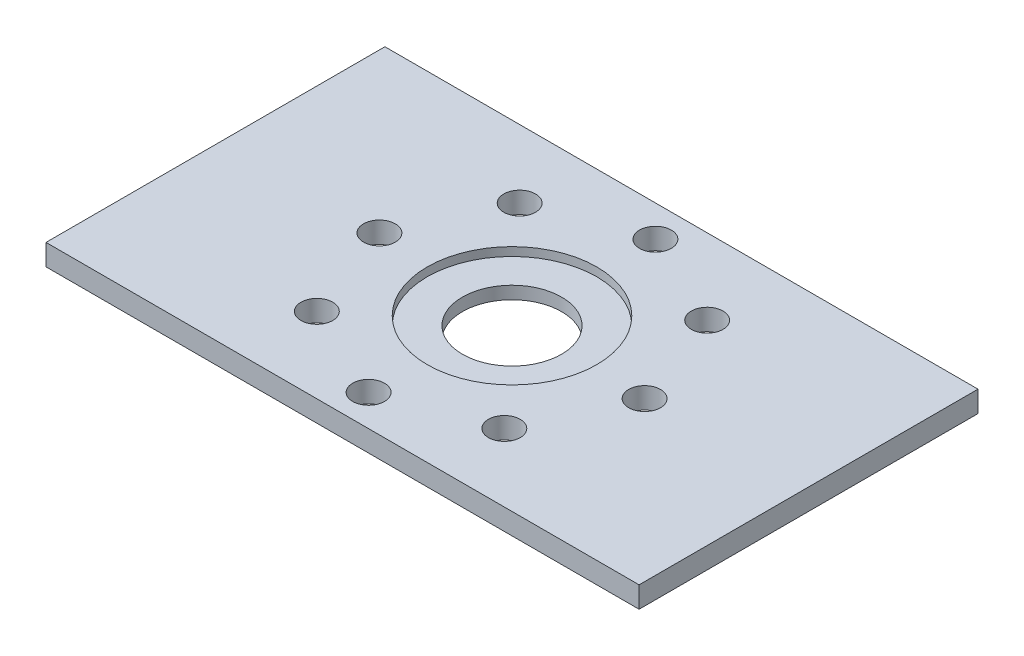
ISO-10303-21;
HEADER;
FILE_DESCRIPTION(('STEP AP214'),'2;1');
FILE_NAME('part.step','',(''),(''),'','','');
FILE_SCHEMA(('AUTOMOTIVE_DESIGN { 1 0 10303 214 1 1 1 1 }'));
ENDSEC;
DATA;
#1=APPLICATION_CONTEXT('core data for automotive mechanical design processes');
#2=APPLICATION_PROTOCOL_DEFINITION('international standard','automotive_design',2000,#1);
#3=PRODUCT_CONTEXT('',#1,'mechanical');
#4=PRODUCT('Part','Part','',(#3));
#5=PRODUCT_RELATED_PRODUCT_CATEGORY('part','',(#4));
#6=PRODUCT_DEFINITION_FORMATION('','',#4);
#7=PRODUCT_DEFINITION_CONTEXT('part definition',#1,'design');
#8=PRODUCT_DEFINITION('design','',#6,#7);
#9=PRODUCT_DEFINITION_SHAPE('','',#8);
#10=(LENGTH_UNIT() NAMED_UNIT(*) SI_UNIT(.MILLI.,.METRE.));
#11=(NAMED_UNIT(*) PLANE_ANGLE_UNIT() SI_UNIT($,.RADIAN.));
#12=(NAMED_UNIT(*) SI_UNIT($,.STERADIAN.) SOLID_ANGLE_UNIT());
#13=UNCERTAINTY_MEASURE_WITH_UNIT(LENGTH_MEASURE(1.E-05),#10,'distance_accuracy_value','');
#14=(GEOMETRIC_REPRESENTATION_CONTEXT(3) GLOBAL_UNCERTAINTY_ASSIGNED_CONTEXT((#13)) GLOBAL_UNIT_ASSIGNED_CONTEXT((#10,
#11,#12)) REPRESENTATION_CONTEXT('',''));
#15=CARTESIAN_POINT('',(0.,0.,0.));
#16=DIRECTION('',(0.,0.,1.));
#17=DIRECTION('',(1.,0.,0.));
#18=AXIS2_PLACEMENT_3D('',#15,#16,#17);
#19=CARTESIAN_POINT('',(0.,0.,0.));
#20=DIRECTION('',(0.,1.,0.));
#21=DIRECTION('',(0.,0.,1.));
#22=AXIS2_PLACEMENT_3D('',#19,#20,#21);
#23=CYLINDRICAL_SURFACE('',#22,14.859);
#24=CARTESIAN_POINT('',(0.,0.,0.));
#25=DIRECTION('',(0.,1.,0.));
#26=DIRECTION('',(0.,0.,1.));
#27=AXIS2_PLACEMENT_3D('',#24,#25,#26);
#28=CIRCLE('',#27,14.859);
#29=CARTESIAN_POINT('',(0.,0.,14.859));
#30=VERTEX_POINT('',#29);
#31=EDGE_CURVE('E105',#30,#30,#28,.T.);
#32=ORIENTED_EDGE('',*,*,#31,.F.);
#33=EDGE_LOOP('',(#32));
#34=FACE_BOUND('',#33,.T.);
#35=CARTESIAN_POINT('',(0.,3.7846,0.));
#36=DIRECTION('',(0.,1.,0.));
#37=DIRECTION('',(0.,0.,1.));
#38=AXIS2_PLACEMENT_3D('',#35,#36,#37);
#39=CIRCLE('',#38,14.859);
#40=CARTESIAN_POINT('',(0.,3.7846,14.859));
#41=VERTEX_POINT('',#40);
#42=EDGE_CURVE('E111',#41,#41,#39,.F.);
#43=ORIENTED_EDGE('',*,*,#42,.F.);
#44=EDGE_LOOP('',(#43));
#45=FACE_BOUND('',#44,.T.);
#46=ADVANCED_FACE('F35',(#34,#45),#23,.F.);
#47=CARTESIAN_POINT('',(88.9,6.35,50.8));
#48=DIRECTION('',(0.,0.,-1.));
#49=DIRECTION('',(-1.,0.,0.));
#50=AXIS2_PLACEMENT_3D('',#47,#48,#49);
#51=PLANE('',#50);
#52=DIRECTION('',(1.,0.,0.));
#53=VECTOR('',#52,1.);
#54=CARTESIAN_POINT('',(88.9,0.,50.8));
#55=LINE('',#54,#53);
#56=CARTESIAN_POINT('',(-88.9,0.,50.8));
#57=VERTEX_POINT('',#56);
#58=CARTESIAN_POINT('',(88.9,0.,50.8));
#59=VERTEX_POINT('',#58);
#60=EDGE_CURVE('E102',#57,#59,#55,.T.);
#61=ORIENTED_EDGE('',*,*,#60,.T.);
#62=DIRECTION('',(0.,-1.,0.));
#63=VECTOR('',#62,1.);
#64=CARTESIAN_POINT('',(88.9,6.35,50.8));
#65=LINE('',#64,#63);
#66=CARTESIAN_POINT('',(88.9,6.35,50.8));
#67=VERTEX_POINT('',#66);
#68=EDGE_CURVE('E11',#67,#59,#65,.T.);
#69=ORIENTED_EDGE('',*,*,#68,.F.);
#70=DIRECTION('',(1.,0.,0.));
#71=VECTOR('',#70,1.);
#72=CARTESIAN_POINT('',(88.9,6.35,50.8));
#73=LINE('',#72,#71);
#74=CARTESIAN_POINT('',(-88.9,6.35,50.8));
#75=VERTEX_POINT('',#74);
#76=EDGE_CURVE('E89',#75,#67,#73,.T.);
#77=ORIENTED_EDGE('',*,*,#76,.F.);
#78=DIRECTION('',(0.,-1.,0.));
#79=VECTOR('',#78,1.);
#80=CARTESIAN_POINT('',(-88.9,6.35,50.8));
#81=LINE('',#80,#79);
#82=EDGE_CURVE('E98',#75,#57,#81,.T.);
#83=ORIENTED_EDGE('',*,*,#82,.T.);
#84=EDGE_LOOP('',(#61,#69,#77,#83));
#85=FACE_BOUND('',#84,.T.);
#86=ADVANCED_FACE('F37',(#85),#51,.F.);
#87=CARTESIAN_POINT('',(88.9,6.35,50.8));
#88=DIRECTION('',(-1.,0.,0.));
#89=DIRECTION('',(0.,0.,1.));
#90=AXIS2_PLACEMENT_3D('',#87,#88,#89);
#91=PLANE('',#90);
#92=DIRECTION('',(0.,0.,-1.));
#93=VECTOR('',#92,1.);
#94=CARTESIAN_POINT('',(88.9,0.,50.8));
#95=LINE('',#94,#93);
#96=CARTESIAN_POINT('',(88.9,0.,-50.8));
#97=VERTEX_POINT('',#96);
#98=EDGE_CURVE('E93',#59,#97,#95,.T.);
#99=ORIENTED_EDGE('',*,*,#98,.T.);
#100=DIRECTION('',(0.,-1.,0.));
#101=VECTOR('',#100,1.);
#102=CARTESIAN_POINT('',(88.9,6.35,-50.8));
#103=LINE('',#102,#101);
#104=CARTESIAN_POINT('',(88.9,6.35,-50.8));
#105=VERTEX_POINT('',#104);
#106=EDGE_CURVE('E45',#105,#97,#103,.T.);
#107=ORIENTED_EDGE('',*,*,#106,.F.);
#108=DIRECTION('',(0.,0.,-1.));
#109=VECTOR('',#108,1.);
#110=CARTESIAN_POINT('',(88.9,6.35,50.8));
#111=LINE('',#110,#109);
#112=EDGE_CURVE('E84',#67,#105,#111,.T.);
#113=ORIENTED_EDGE('',*,*,#112,.F.);
#114=ORIENTED_EDGE('',*,*,#68,.T.);
#115=EDGE_LOOP('',(#99,#107,#113,#114));
#116=FACE_BOUND('',#115,.T.);
#117=ADVANCED_FACE('F92',(#116),#91,.F.);
#118=CARTESIAN_POINT('',(88.9,6.35,-50.8));
#119=DIRECTION('',(0.,0.,1.));
#120=DIRECTION('',(1.,0.,0.));
#121=AXIS2_PLACEMENT_3D('',#118,#119,#120);
#122=PLANE('',#121);
#123=DIRECTION('',(-1.,0.,0.));
#124=VECTOR('',#123,1.);
#125=CARTESIAN_POINT('',(88.9,0.,-50.8));
#126=LINE('',#125,#124);
#127=CARTESIAN_POINT('',(-88.9,0.,-50.8));
#128=VERTEX_POINT('',#127);
#129=EDGE_CURVE('E71',#97,#128,#126,.T.);
#130=ORIENTED_EDGE('',*,*,#129,.T.);
#131=DIRECTION('',(0.,-1.,0.));
#132=VECTOR('',#131,1.);
#133=CARTESIAN_POINT('',(-88.9,6.35,-50.8));
#134=LINE('',#133,#132);
#135=CARTESIAN_POINT('',(-88.9,6.35,-50.8));
#136=VERTEX_POINT('',#135);
#137=EDGE_CURVE('E94',#136,#128,#134,.T.);
#138=ORIENTED_EDGE('',*,*,#137,.F.);
#139=DIRECTION('',(-1.,0.,0.));
#140=VECTOR('',#139,1.);
#141=CARTESIAN_POINT('',(88.9,6.35,-50.8));
#142=LINE('',#141,#140);
#143=EDGE_CURVE('E87',#105,#136,#142,.T.);
#144=ORIENTED_EDGE('',*,*,#143,.F.);
#145=ORIENTED_EDGE('',*,*,#106,.T.);
#146=EDGE_LOOP('',(#130,#138,#144,#145));
#147=FACE_BOUND('',#146,.T.);
#148=ADVANCED_FACE('F96',(#147),#122,.F.);
#149=CARTESIAN_POINT('',(-88.9,6.35,50.8));
#150=DIRECTION('',(1.,0.,0.));
#151=DIRECTION('',(0.,0.,-1.));
#152=AXIS2_PLACEMENT_3D('',#149,#150,#151);
#153=PLANE('',#152);
#154=DIRECTION('',(0.,0.,1.));
#155=VECTOR('',#154,1.);
#156=CARTESIAN_POINT('',(-88.9,0.,50.8));
#157=LINE('',#156,#155);
#158=EDGE_CURVE('E77',#128,#57,#157,.T.);
#159=ORIENTED_EDGE('',*,*,#158,.T.);
#160=ORIENTED_EDGE('',*,*,#82,.F.);
#161=DIRECTION('',(0.,0.,1.));
#162=VECTOR('',#161,1.);
#163=CARTESIAN_POINT('',(-88.9,6.35,50.8));
#164=LINE('',#163,#162);
#165=EDGE_CURVE('E54',#136,#75,#164,.T.);
#166=ORIENTED_EDGE('',*,*,#165,.F.);
#167=ORIENTED_EDGE('',*,*,#137,.T.);
#168=EDGE_LOOP('',(#159,#160,#166,#167));
#169=FACE_BOUND('',#168,.T.);
#170=ADVANCED_FACE('F182',(#169),#153,.F.);
#171=CARTESIAN_POINT('',(0.,6.35,0.));
#172=DIRECTION('',(0.,-1.,0.));
#173=DIRECTION('',(0.,0.,-1.));
#174=AXIS2_PLACEMENT_3D('',#171,#172,#173);
#175=PLANE('',#174);
#176=CARTESIAN_POINT('',(-41.3701595695863,6.35,-1.62342267662033));
#177=DIRECTION('',(0.,1.,0.));
#178=DIRECTION('',(1.,0.,0.));
#179=AXIS2_PLACEMENT_3D('',#176,#177,#178);
#180=CIRCLE('',#179,4.7625);
#181=CARTESIAN_POINT('',(-36.6076595695863,6.35,-1.62342267662034));
#182=VERTEX_POINT('',#181);
#183=EDGE_CURVE('E308',#182,#182,#180,.T.);
#184=ORIENTED_EDGE('',*,*,#183,.F.);
#185=EDGE_LOOP('',(#184));
#186=FACE_BOUND('',#185,.T.);
#187=CARTESIAN_POINT('',(-30.4010535537942,6.35,28.1051871870538));
#188=DIRECTION('',(0.,1.,0.));
#189=DIRECTION('',(0.707106781186544,0.,-0.707106781186551));
#190=AXIS2_PLACEMENT_3D('',#187,#188,#189);
#191=CIRCLE('',#190,4.7625);
#192=CARTESIAN_POINT('',(-27.0334575083933,6.35,24.7375911416529));
#193=VERTEX_POINT('',#192);
#194=EDGE_CURVE('E309',#193,#193,#191,.T.);
#195=ORIENTED_EDGE('',*,*,#194,.F.);
#196=EDGE_LOOP('',(#195));
#197=FACE_BOUND('',#196,.T.);
#198=CARTESIAN_POINT('',(-1.62342267662047,6.35,41.3701595695863));
#199=DIRECTION('',(0.,1.,0.));
#200=DIRECTION('',(0.,0.,-1.));
#201=AXIS2_PLACEMENT_3D('',#198,#199,#200);
#202=CIRCLE('',#201,4.7625);
#203=CARTESIAN_POINT('',(-1.62342267662047,6.35,36.6076595695863));
#204=VERTEX_POINT('',#203);
#205=EDGE_CURVE('E313',#204,#204,#202,.T.);
#206=ORIENTED_EDGE('',*,*,#205,.F.);
#207=EDGE_LOOP('',(#206));
#208=FACE_BOUND('',#207,.T.);
#209=CARTESIAN_POINT('',(28.1051871870539,6.35,30.4010535537941));
#210=DIRECTION('',(0.,1.,0.));
#211=DIRECTION('',(-0.707106781186554,0.,-0.707106781186541));
#212=AXIS2_PLACEMENT_3D('',#209,#210,#211);
#213=CIRCLE('',#212,4.7625);
#214=CARTESIAN_POINT('',(24.737591141653,6.35,27.0334575083932));
#215=VERTEX_POINT('',#214);
#216=EDGE_CURVE('E320',#215,#215,#213,.T.);
#217=ORIENTED_EDGE('',*,*,#216,.F.);
#218=EDGE_LOOP('',(#217));
#219=FACE_BOUND('',#218,.T.);
#220=CARTESIAN_POINT('',(41.3701595695863,6.35,1.62342267662004));
#221=DIRECTION('',(0.,1.,0.));
#222=DIRECTION('',(-1.,0.,0.));
#223=AXIS2_PLACEMENT_3D('',#220,#221,#222);
#224=CIRCLE('',#223,4.7625);
#225=CARTESIAN_POINT('',(36.6076595695863,6.35,1.62342267662009));
#226=VERTEX_POINT('',#225);
#227=EDGE_CURVE('E322',#226,#226,#224,.T.);
#228=ORIENTED_EDGE('',*,*,#227,.F.);
#229=EDGE_LOOP('',(#228));
#230=FACE_BOUND('',#229,.T.);
#231=CARTESIAN_POINT('',(30.401053553794,6.35,-28.105187187054));
#232=DIRECTION('',(0.,1.,0.));
#233=DIRECTION('',(-0.707106781186539,0.,0.707106781186556));
#234=AXIS2_PLACEMENT_3D('',#231,#232,#233);
#235=CIRCLE('',#234,4.7625);
#236=CARTESIAN_POINT('',(27.0334575083931,6.35,-24.7375911416531));
#237=VERTEX_POINT('',#236);
#238=EDGE_CURVE('E316',#237,#237,#235,.T.);
#239=ORIENTED_EDGE('',*,*,#238,.F.);
#240=EDGE_LOOP('',(#239));
#241=FACE_BOUND('',#240,.T.);
#242=CARTESIAN_POINT('',(-28.1051871870537,6.35,-30.4010535537943));
#243=DIRECTION('',(0.,1.,0.));
#244=DIRECTION('',(0.707106781186549,0.,0.707106781186546));
#245=AXIS2_PLACEMENT_3D('',#242,#243,#244);
#246=CIRCLE('',#245,4.7625);
#247=CARTESIAN_POINT('',(-24.7375911416528,6.35,-27.0334575083934));
#248=VERTEX_POINT('',#247);
#249=EDGE_CURVE('E124',#248,#248,#246,.T.);
#250=ORIENTED_EDGE('',*,*,#249,.F.);
#251=EDGE_LOOP('',(#250));
#252=FACE_BOUND('',#251,.T.);
#253=CARTESIAN_POINT('',(1.62342267662047,6.35,-41.3701595695863));
#254=DIRECTION('',(0.,1.,0.));
#255=DIRECTION('',(0.,0.,1.));
#256=AXIS2_PLACEMENT_3D('',#253,#254,#255);
#257=CIRCLE('',#256,4.7625);
#258=CARTESIAN_POINT('',(1.62342267662047,6.35,-36.6076595695863));
#259=VERTEX_POINT('',#258);
#260=EDGE_CURVE('E119',#259,#259,#257,.T.);
#261=ORIENTED_EDGE('',*,*,#260,.F.);
#262=EDGE_LOOP('',(#261));
#263=FACE_BOUND('',#262,.T.);
#264=CARTESIAN_POINT('',(0.,6.35,0.));
#265=DIRECTION('',(0.,1.,0.));
#266=DIRECTION('',(0.,0.,1.));
#267=AXIS2_PLACEMENT_3D('',#264,#265,#266);
#268=CIRCLE('',#267,25.4);
#269=CARTESIAN_POINT('',(0.,6.35,25.4));
#270=VERTEX_POINT('',#269);
#271=EDGE_CURVE('E118',#270,#270,#268,.T.);
#272=ORIENTED_EDGE('',*,*,#271,.F.);
#273=EDGE_LOOP('',(#272));
#274=FACE_BOUND('',#273,.T.);
#275=ORIENTED_EDGE('',*,*,#76,.T.);
#276=ORIENTED_EDGE('',*,*,#112,.T.);
#277=ORIENTED_EDGE('',*,*,#143,.T.);
#278=ORIENTED_EDGE('',*,*,#165,.T.);
#279=EDGE_LOOP('',(#275,#276,#277,#278));
#280=FACE_BOUND('',#279,.T.);
#281=ADVANCED_FACE('F85',(#186,#197,#208,#219,#230,#241,#252,#263,#274,#280),#175,.F.);
#282=CARTESIAN_POINT('',(0.,0.,0.));
#283=DIRECTION('',(0.,-1.,0.));
#284=DIRECTION('',(0.,0.,-1.));
#285=AXIS2_PLACEMENT_3D('',#282,#283,#284);
#286=PLANE('',#285);
#287=CARTESIAN_POINT('',(-41.3701595695863,0.,-1.62342267662033));
#288=DIRECTION('',(0.,-1.,0.));
#289=DIRECTION('',(0.,0.,-1.));
#290=AXIS2_PLACEMENT_3D('',#287,#288,#289);
#291=CIRCLE('',#290,4.7625);
#292=CARTESIAN_POINT('',(-41.3701595695863,0.,-6.38592267662033));
#293=VERTEX_POINT('',#292);
#294=EDGE_CURVE('E39',#293,#293,#291,.T.);
#295=ORIENTED_EDGE('',*,*,#294,.F.);
#296=EDGE_LOOP('',(#295));
#297=FACE_BOUND('',#296,.T.);
#298=CARTESIAN_POINT('',(-30.4010535537942,0.,28.1051871870538));
#299=DIRECTION('',(0.,-1.,0.));
#300=DIRECTION('',(0.,0.,-1.));
#301=AXIS2_PLACEMENT_3D('',#298,#299,#300);
#302=CIRCLE('',#301,4.7625);
#303=CARTESIAN_POINT('',(-30.4010535537942,0.,23.3426871870538));
#304=VERTEX_POINT('',#303);
#305=EDGE_CURVE('E135',#304,#304,#302,.T.);
#306=ORIENTED_EDGE('',*,*,#305,.F.);
#307=EDGE_LOOP('',(#306));
#308=FACE_BOUND('',#307,.T.);
#309=CARTESIAN_POINT('',(-1.62342267662047,0.,41.3701595695863));
#310=DIRECTION('',(0.,-1.,0.));
#311=DIRECTION('',(0.,0.,-1.));
#312=AXIS2_PLACEMENT_3D('',#309,#310,#311);
#313=CIRCLE('',#312,4.7625);
#314=CARTESIAN_POINT('',(-1.62342267662047,0.,36.6076595695863));
#315=VERTEX_POINT('',#314);
#316=EDGE_CURVE('E133',#315,#315,#313,.T.);
#317=ORIENTED_EDGE('',*,*,#316,.F.);
#318=EDGE_LOOP('',(#317));
#319=FACE_BOUND('',#318,.T.);
#320=CARTESIAN_POINT('',(28.1051871870539,0.,30.4010535537941));
#321=DIRECTION('',(0.,-1.,0.));
#322=DIRECTION('',(0.,0.,-1.));
#323=AXIS2_PLACEMENT_3D('',#320,#321,#322);
#324=CIRCLE('',#323,4.7625);
#325=CARTESIAN_POINT('',(28.1051871870539,0.,25.6385535537941));
#326=VERTEX_POINT('',#325);
#327=EDGE_CURVE('E130',#326,#326,#324,.T.);
#328=ORIENTED_EDGE('',*,*,#327,.F.);
#329=EDGE_LOOP('',(#328));
#330=FACE_BOUND('',#329,.T.);
#331=CARTESIAN_POINT('',(41.3701595695863,0.,1.62342267662004));
#332=DIRECTION('',(0.,-1.,0.));
#333=DIRECTION('',(0.,0.,-1.));
#334=AXIS2_PLACEMENT_3D('',#331,#332,#333);
#335=CIRCLE('',#334,4.7625);
#336=CARTESIAN_POINT('',(41.3701595695863,0.,-3.13907732337996));
#337=VERTEX_POINT('',#336);
#338=EDGE_CURVE('E127',#337,#337,#335,.T.);
#339=ORIENTED_EDGE('',*,*,#338,.F.);
#340=EDGE_LOOP('',(#339));
#341=FACE_BOUND('',#340,.T.);
#342=CARTESIAN_POINT('',(30.401053553794,0.,-28.105187187054));
#343=DIRECTION('',(0.,-1.,0.));
#344=DIRECTION('',(0.,0.,-1.));
#345=AXIS2_PLACEMENT_3D('',#342,#343,#344);
#346=CIRCLE('',#345,4.7625);
#347=CARTESIAN_POINT('',(30.401053553794,0.,-32.867687187054));
#348=VERTEX_POINT('',#347);
#349=EDGE_CURVE('E123',#348,#348,#346,.T.);
#350=ORIENTED_EDGE('',*,*,#349,.F.);
#351=EDGE_LOOP('',(#350));
#352=FACE_BOUND('',#351,.T.);
#353=CARTESIAN_POINT('',(-28.1051871870537,0.,-30.4010535537943));
#354=DIRECTION('',(0.,-1.,0.));
#355=DIRECTION('',(0.,0.,-1.));
#356=AXIS2_PLACEMENT_3D('',#353,#354,#355);
#357=CIRCLE('',#356,4.7625);
#358=CARTESIAN_POINT('',(-28.1051871870537,0.,-35.1635535537943));
#359=VERTEX_POINT('',#358);
#360=EDGE_CURVE('E120',#359,#359,#357,.T.);
#361=ORIENTED_EDGE('',*,*,#360,.F.);
#362=EDGE_LOOP('',(#361));
#363=FACE_BOUND('',#362,.T.);
#364=CARTESIAN_POINT('',(1.62342267662047,0.,-41.3701595695863));
#365=DIRECTION('',(0.,-1.,0.));
#366=DIRECTION('',(0.,0.,-1.));
#367=AXIS2_PLACEMENT_3D('',#364,#365,#366);
#368=CIRCLE('',#367,4.7625);
#369=CARTESIAN_POINT('',(1.62342267662047,0.,-46.1326595695863));
#370=VERTEX_POINT('',#369);
#371=EDGE_CURVE('E115',#370,#370,#368,.T.);
#372=ORIENTED_EDGE('',*,*,#371,.F.);
#373=EDGE_LOOP('',(#372));
#374=FACE_BOUND('',#373,.T.);
#375=ORIENTED_EDGE('',*,*,#31,.T.);
#376=EDGE_LOOP('',(#375));
#377=FACE_BOUND('',#376,.T.);
#378=ORIENTED_EDGE('',*,*,#60,.F.);
#379=ORIENTED_EDGE('',*,*,#158,.F.);
#380=ORIENTED_EDGE('',*,*,#129,.F.);
#381=ORIENTED_EDGE('',*,*,#98,.F.);
#382=EDGE_LOOP('',(#378,#379,#380,#381));
#383=FACE_BOUND('',#382,.T.);
#384=ADVANCED_FACE('F156',(#297,#308,#319,#330,#341,#352,#363,#374,#377,#383),#286,.T.);
#385=CARTESIAN_POINT('',(0.,3.7846,0.));
#386=DIRECTION('',(0.,1.,0.));
#387=DIRECTION('',(0.,0.,1.));
#388=AXIS2_PLACEMENT_3D('',#385,#386,#387);
#389=PLANE('',#388);
#390=CARTESIAN_POINT('',(0.,3.7846,0.));
#391=DIRECTION('',(0.,1.,0.));
#392=DIRECTION('',(0.,0.,1.));
#393=AXIS2_PLACEMENT_3D('',#390,#391,#392);
#394=CIRCLE('',#393,25.4);
#395=CARTESIAN_POINT('',(0.,3.7846,25.4));
#396=VERTEX_POINT('',#395);
#397=EDGE_CURVE('E114',#396,#396,#394,.T.);
#398=ORIENTED_EDGE('',*,*,#397,.T.);
#399=EDGE_LOOP('',(#398));
#400=FACE_BOUND('',#399,.T.);
#401=ORIENTED_EDGE('',*,*,#42,.T.);
#402=EDGE_LOOP('',(#401));
#403=FACE_BOUND('',#402,.T.);
#404=ADVANCED_FACE('F164',(#400,#403),#389,.T.);
#405=CARTESIAN_POINT('',(0.,3.7846,0.));
#406=DIRECTION('',(0.,1.,0.));
#407=DIRECTION('',(0.,0.,1.));
#408=AXIS2_PLACEMENT_3D('',#405,#406,#407);
#409=CYLINDRICAL_SURFACE('',#408,25.4);
#410=ORIENTED_EDGE('',*,*,#397,.F.);
#411=EDGE_LOOP('',(#410));
#412=FACE_BOUND('',#411,.T.);
#413=ORIENTED_EDGE('',*,*,#271,.T.);
#414=EDGE_LOOP('',(#413));
#415=FACE_BOUND('',#414,.T.);
#416=ADVANCED_FACE('F166',(#412,#415),#409,.F.);
#417=CARTESIAN_POINT('',(1.62342267662047,-13.9954,-41.3701595695863));
#418=DIRECTION('',(0.,1.,0.));
#419=DIRECTION('',(0.,0.,1.));
#420=AXIS2_PLACEMENT_3D('',#417,#418,#419);
#421=CYLINDRICAL_SURFACE('',#420,4.7625);
#422=ORIENTED_EDGE('',*,*,#371,.T.);
#423=EDGE_LOOP('',(#422));
#424=FACE_BOUND('',#423,.T.);
#425=ORIENTED_EDGE('',*,*,#260,.T.);
#426=EDGE_LOOP('',(#425));
#427=FACE_BOUND('',#426,.T.);
#428=ADVANCED_FACE('F173',(#424,#427),#421,.F.);
#429=CARTESIAN_POINT('',(-28.1051871870537,-13.9954,-30.4010535537943));
#430=DIRECTION('',(0.,1.,0.));
#431=DIRECTION('',(0.,0.,1.));
#432=AXIS2_PLACEMENT_3D('',#429,#430,#431);
#433=CYLINDRICAL_SURFACE('',#432,4.7625);
#434=ORIENTED_EDGE('',*,*,#360,.T.);
#435=EDGE_LOOP('',(#434));
#436=FACE_BOUND('',#435,.T.);
#437=ORIENTED_EDGE('',*,*,#249,.T.);
#438=EDGE_LOOP('',(#437));
#439=FACE_BOUND('',#438,.T.);
#440=ADVANCED_FACE('F224',(#436,#439),#433,.F.);
#441=CARTESIAN_POINT('',(30.401053553794,-13.9954,-28.105187187054));
#442=DIRECTION('',(0.,1.,0.));
#443=DIRECTION('',(0.,0.,1.));
#444=AXIS2_PLACEMENT_3D('',#441,#442,#443);
#445=CYLINDRICAL_SURFACE('',#444,4.7625);
#446=ORIENTED_EDGE('',*,*,#349,.T.);
#447=EDGE_LOOP('',(#446));
#448=FACE_BOUND('',#447,.T.);
#449=ORIENTED_EDGE('',*,*,#238,.T.);
#450=EDGE_LOOP('',(#449));
#451=FACE_BOUND('',#450,.T.);
#452=ADVANCED_FACE('F244',(#448,#451),#445,.F.);
#453=CARTESIAN_POINT('',(41.3701595695863,-13.9954,1.62342267662004));
#454=DIRECTION('',(0.,1.,0.));
#455=DIRECTION('',(0.,0.,1.));
#456=AXIS2_PLACEMENT_3D('',#453,#454,#455);
#457=CYLINDRICAL_SURFACE('',#456,4.7625);
#458=ORIENTED_EDGE('',*,*,#338,.T.);
#459=EDGE_LOOP('',(#458));
#460=FACE_BOUND('',#459,.T.);
#461=ORIENTED_EDGE('',*,*,#227,.T.);
#462=EDGE_LOOP('',(#461));
#463=FACE_BOUND('',#462,.T.);
#464=ADVANCED_FACE('F253',(#460,#463),#457,.F.);
#465=CARTESIAN_POINT('',(28.1051871870539,-13.9954,30.4010535537941));
#466=DIRECTION('',(0.,1.,0.));
#467=DIRECTION('',(0.,0.,1.));
#468=AXIS2_PLACEMENT_3D('',#465,#466,#467);
#469=CYLINDRICAL_SURFACE('',#468,4.7625);
#470=ORIENTED_EDGE('',*,*,#327,.T.);
#471=EDGE_LOOP('',(#470));
#472=FACE_BOUND('',#471,.T.);
#473=ORIENTED_EDGE('',*,*,#216,.T.);
#474=EDGE_LOOP('',(#473));
#475=FACE_BOUND('',#474,.T.);
#476=ADVANCED_FACE('F263',(#472,#475),#469,.F.);
#477=CARTESIAN_POINT('',(-1.62342267662047,-13.9954,41.3701595695863));
#478=DIRECTION('',(0.,1.,0.));
#479=DIRECTION('',(0.,0.,1.));
#480=AXIS2_PLACEMENT_3D('',#477,#478,#479);
#481=CYLINDRICAL_SURFACE('',#480,4.7625);
#482=ORIENTED_EDGE('',*,*,#316,.T.);
#483=EDGE_LOOP('',(#482));
#484=FACE_BOUND('',#483,.T.);
#485=ORIENTED_EDGE('',*,*,#205,.T.);
#486=EDGE_LOOP('',(#485));
#487=FACE_BOUND('',#486,.T.);
#488=ADVANCED_FACE('F273',(#484,#487),#481,.F.);
#489=CARTESIAN_POINT('',(-30.4010535537942,-13.9954,28.1051871870538));
#490=DIRECTION('',(0.,1.,0.));
#491=DIRECTION('',(0.,0.,1.));
#492=AXIS2_PLACEMENT_3D('',#489,#490,#491);
#493=CYLINDRICAL_SURFACE('',#492,4.7625);
#494=ORIENTED_EDGE('',*,*,#305,.T.);
#495=EDGE_LOOP('',(#494));
#496=FACE_BOUND('',#495,.T.);
#497=ORIENTED_EDGE('',*,*,#194,.T.);
#498=EDGE_LOOP('',(#497));
#499=FACE_BOUND('',#498,.T.);
#500=ADVANCED_FACE('F283',(#496,#499),#493,.F.);
#501=CARTESIAN_POINT('',(-41.3701595695863,-13.9954,-1.62342267662033));
#502=DIRECTION('',(0.,1.,0.));
#503=DIRECTION('',(0.,0.,1.));
#504=AXIS2_PLACEMENT_3D('',#501,#502,#503);
#505=CYLINDRICAL_SURFACE('',#504,4.7625);
#506=ORIENTED_EDGE('',*,*,#294,.T.);
#507=EDGE_LOOP('',(#506));
#508=FACE_BOUND('',#507,.T.);
#509=ORIENTED_EDGE('',*,*,#183,.T.);
#510=EDGE_LOOP('',(#509));
#511=FACE_BOUND('',#510,.T.);
#512=ADVANCED_FACE('F293',(#508,#511),#505,.F.);
#513=CLOSED_SHELL('',(#46,#86,#117,#148,#170,#281,#384,#404,#416,#428,#440,#452,#464,#476,#488,
#500,#512));
#514=MANIFOLD_SOLID_BREP('B2',#513);
#515=ADVANCED_BREP_SHAPE_REPRESENTATION('',(#18,#514),#14);
#516=SHAPE_DEFINITION_REPRESENTATION(#9,#515);
ENDSEC;
END-ISO-10303-21;
